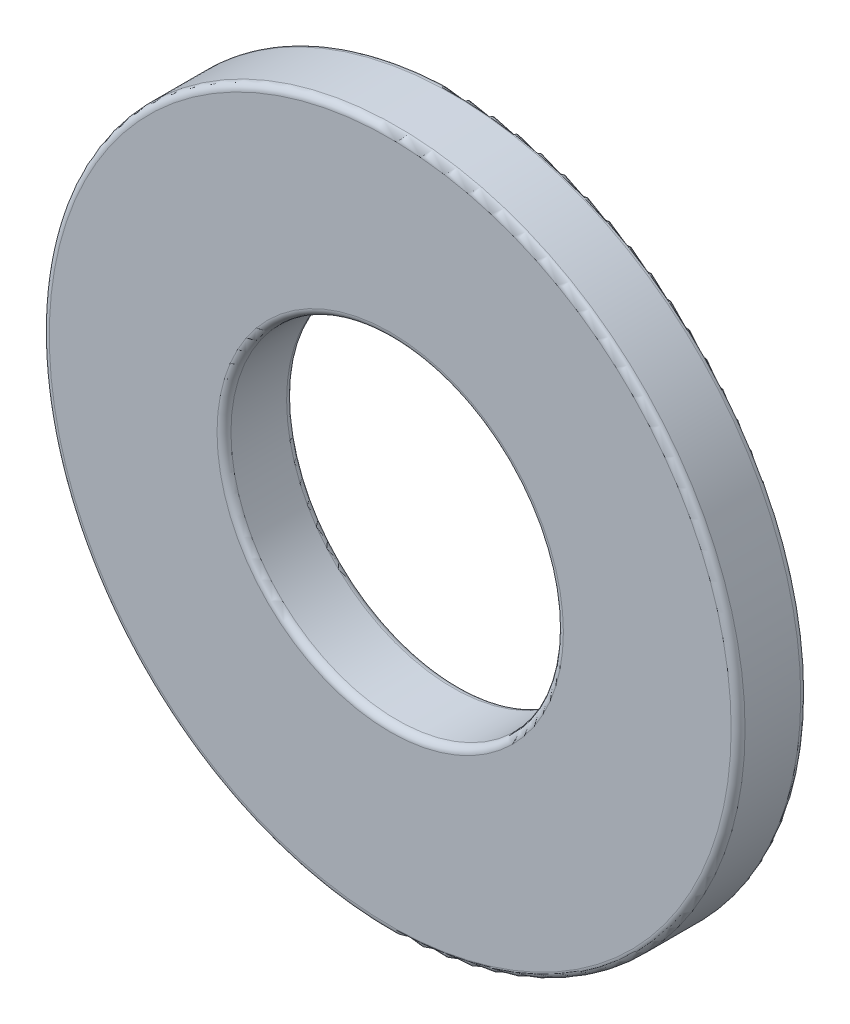
ISO-10303-21;
HEADER;
FILE_DESCRIPTION(('STEP AP214'),'2;1');
FILE_NAME('part.step','',(''),(''),'','','');
FILE_SCHEMA(('AUTOMOTIVE_DESIGN { 1 0 10303 214 1 1 1 1 }'));
ENDSEC;
DATA;
#1=APPLICATION_CONTEXT('core data for automotive mechanical design processes');
#2=APPLICATION_PROTOCOL_DEFINITION('international standard','automotive_design',2000,#1);
#3=PRODUCT_CONTEXT('',#1,'mechanical');
#4=PRODUCT('Part','Part','',(#3));
#5=PRODUCT_RELATED_PRODUCT_CATEGORY('part','',(#4));
#6=PRODUCT_DEFINITION_FORMATION('','',#4);
#7=PRODUCT_DEFINITION_CONTEXT('part definition',#1,'design');
#8=PRODUCT_DEFINITION('design','',#6,#7);
#9=PRODUCT_DEFINITION_SHAPE('','',#8);
#10=(LENGTH_UNIT() NAMED_UNIT(*) SI_UNIT(.MILLI.,.METRE.));
#11=(NAMED_UNIT(*) PLANE_ANGLE_UNIT() SI_UNIT($,.RADIAN.));
#12=(NAMED_UNIT(*) SI_UNIT($,.STERADIAN.) SOLID_ANGLE_UNIT());
#13=UNCERTAINTY_MEASURE_WITH_UNIT(LENGTH_MEASURE(1.E-05),#10,'distance_accuracy_value','');
#14=(GEOMETRIC_REPRESENTATION_CONTEXT(3) GLOBAL_UNCERTAINTY_ASSIGNED_CONTEXT((#13)) GLOBAL_UNIT_ASSIGNED_CONTEXT((#10,
#11,#12)) REPRESENTATION_CONTEXT('',''));
#15=CARTESIAN_POINT('',(0.,0.,0.));
#16=DIRECTION('',(0.,0.,1.));
#17=DIRECTION('',(1.,0.,0.));
#18=AXIS2_PLACEMENT_3D('',#15,#16,#17);
#19=CARTESIAN_POINT('',(0.,0.,-0.449999999999994));
#20=DIRECTION('',(0.,0.,1.));
#21=DIRECTION('',(1.,0.,0.));
#22=AXIS2_PLACEMENT_3D('',#19,#20,#21);
#23=CYLINDRICAL_SURFACE('',#22,4.5);
#24=CARTESIAN_POINT('',(0.,0.,-0.359999999999994));
#25=DIRECTION('',(0.,0.,1.));
#26=DIRECTION('',(1.,0.,0.));
#27=AXIS2_PLACEMENT_3D('',#24,#25,#26);
#28=CIRCLE('',#27,4.5);
#29=CARTESIAN_POINT('',(4.5,0.,-0.359999999999994));
#30=VERTEX_POINT('',#29);
#31=EDGE_CURVE('E73',#30,#30,#28,.T.);
#32=CARTESIAN_POINT('',(0.,0.,0.360000000000006));
#33=DIRECTION('',(0.,0.,1.));
#34=DIRECTION('',(1.,0.,0.));
#35=AXIS2_PLACEMENT_3D('',#32,#33,#34);
#36=CIRCLE('',#35,4.5);
#37=CARTESIAN_POINT('',(4.5,0.,0.360000000000006));
#38=VERTEX_POINT('',#37);
#39=EDGE_CURVE('E77',#38,#38,#36,.F.);
#40=CARTESIAN_POINT('',(4.5,0.,-0.359999999999994));
#41=CARTESIAN_POINT('',(4.5,0.,-0.352499999999994));
#42=CARTESIAN_POINT('',(4.5,0.,-0.344999999999994));
#43=CARTESIAN_POINT('',(4.5,0.,-0.329999999999994));
#44=CARTESIAN_POINT('',(4.5,0.,-0.322499999999994));
#45=CARTESIAN_POINT('',(4.5,0.,-0.307499999999994));
#46=CARTESIAN_POINT('',(4.5,0.,-0.299999999999994));
#47=CARTESIAN_POINT('',(4.5,0.,-0.284999999999994));
#48=CARTESIAN_POINT('',(4.5,0.,-0.277499999999994));
#49=CARTESIAN_POINT('',(4.5,0.,-0.262499999999994));
#50=CARTESIAN_POINT('',(4.5,0.,-0.254999999999994));
#51=CARTESIAN_POINT('',(4.5,0.,-0.239999999999994));
#52=CARTESIAN_POINT('',(4.5,0.,-0.232499999999994));
#53=CARTESIAN_POINT('',(4.5,0.,-0.217499999999994));
#54=CARTESIAN_POINT('',(4.5,0.,-0.209999999999994));
#55=CARTESIAN_POINT('',(4.5,0.,-0.194999999999994));
#56=CARTESIAN_POINT('',(4.5,0.,-0.187499999999994));
#57=CARTESIAN_POINT('',(4.5,0.,-0.172499999999994));
#58=CARTESIAN_POINT('',(4.5,0.,-0.164999999999994));
#59=CARTESIAN_POINT('',(4.5,0.,-0.149999999999994));
#60=CARTESIAN_POINT('',(4.5,0.,-0.142499999999994));
#61=CARTESIAN_POINT('',(4.5,0.,-0.127499999999994));
#62=CARTESIAN_POINT('',(4.5,0.,-0.119999999999994));
#63=CARTESIAN_POINT('',(4.5,0.,-0.104999999999994));
#64=CARTESIAN_POINT('',(4.5,0.,-0.0974999999999938));
#65=CARTESIAN_POINT('',(4.5,0.,-0.0824999999999938));
#66=CARTESIAN_POINT('',(4.5,0.,-0.0749999999999938));
#67=CARTESIAN_POINT('',(4.5,0.,-0.0599999999999938));
#68=CARTESIAN_POINT('',(4.5,0.,-0.0524999999999938));
#69=CARTESIAN_POINT('',(4.5,0.,-0.0374999999999938));
#70=CARTESIAN_POINT('',(4.5,0.,-0.0299999999999938));
#71=CARTESIAN_POINT('',(4.5,0.,-0.0149999999999938));
#72=CARTESIAN_POINT('',(4.5,0.,-0.00749999999999379));
#73=CARTESIAN_POINT('',(4.5,0.,0.00750000000000622));
#74=CARTESIAN_POINT('',(4.5,0.,0.0150000000000062));
#75=CARTESIAN_POINT('',(4.5,0.,0.0300000000000062));
#76=CARTESIAN_POINT('',(4.5,0.,0.0375000000000062));
#77=CARTESIAN_POINT('',(4.5,0.,0.0525000000000062));
#78=CARTESIAN_POINT('',(4.5,0.,0.0600000000000062));
#79=CARTESIAN_POINT('',(4.5,0.,0.0750000000000062));
#80=CARTESIAN_POINT('',(4.5,0.,0.0825000000000062));
#81=CARTESIAN_POINT('',(4.5,0.,0.0975000000000062));
#82=CARTESIAN_POINT('',(4.5,0.,0.105000000000006));
#83=CARTESIAN_POINT('',(4.5,0.,0.120000000000006));
#84=CARTESIAN_POINT('',(4.5,0.,0.127500000000006));
#85=CARTESIAN_POINT('',(4.5,0.,0.142500000000006));
#86=CARTESIAN_POINT('',(4.5,0.,0.150000000000006));
#87=CARTESIAN_POINT('',(4.5,0.,0.165000000000006));
#88=CARTESIAN_POINT('',(4.5,0.,0.172500000000006));
#89=CARTESIAN_POINT('',(4.5,0.,0.187500000000006));
#90=CARTESIAN_POINT('',(4.5,0.,0.195000000000006));
#91=CARTESIAN_POINT('',(4.5,0.,0.210000000000006));
#92=CARTESIAN_POINT('',(4.5,0.,0.217500000000006));
#93=CARTESIAN_POINT('',(4.5,0.,0.232500000000006));
#94=CARTESIAN_POINT('',(4.5,0.,0.240000000000006));
#95=CARTESIAN_POINT('',(4.5,0.,0.255000000000006));
#96=CARTESIAN_POINT('',(4.5,0.,0.262500000000006));
#97=CARTESIAN_POINT('',(4.5,0.,0.277500000000006));
#98=CARTESIAN_POINT('',(4.5,0.,0.285000000000006));
#99=CARTESIAN_POINT('',(4.5,0.,0.300000000000006));
#100=CARTESIAN_POINT('',(4.5,0.,0.307500000000006));
#101=CARTESIAN_POINT('',(4.5,0.,0.322500000000006));
#102=CARTESIAN_POINT('',(4.5,0.,0.330000000000006));
#103=CARTESIAN_POINT('',(4.5,0.,0.345000000000006));
#104=CARTESIAN_POINT('',(4.5,0.,0.352500000000006));
#105=CARTESIAN_POINT('',(4.5,0.,0.360000000000006));
#106=B_SPLINE_CURVE_WITH_KNOTS('',3,(#40,#41,#42,#43,#44,#45,#46,#47,#48,#49,#50,#51,#52,#53,
#54,#55,#56,#57,#58,#59,#60,#61,#62,#63,#64,#65,#66,#67,#68,#69,#70,#71,#72,#73,#74,#75,#76,#77,
#78,#79,#80,#81,#82,#83,#84,#85,#86,#87,#88,#89,#90,#91,#92,#93,#94,#95,#96,#97,#98,#99,#100,
#101,#102,#103,#104,#105),.UNSPECIFIED.,.F.,.F.,(4,2,2,2,2,2,2,2,2,2,2,2,2,2,2,2,2,2,2,2,2,2,2,
2,2,2,2,2,2,2,2,2,4),(0.,0.0225,0.045,0.0675,0.09,0.1125,0.135,0.1575,0.18,0.2025,0.225,0.2475,
0.27,0.2925,0.315,0.3375,0.36,0.3825,0.405,0.4275,0.45,0.4725,0.495,0.5175,0.54,0.5625,0.585,
0.6075,0.63,0.6525,0.675,0.6975,0.72),.UNSPECIFIED.);
#107=EDGE_CURVE('BSEAM41',#30,#38,#106,.T.);
#108=ORIENTED_EDGE('',*,*,#31,.T.);
#109=ORIENTED_EDGE('',*,*,#39,.T.);
#110=ORIENTED_EDGE('',*,*,#107,.T.);
#111=ORIENTED_EDGE('',*,*,#107,.F.);
#112=EDGE_LOOP('',(#108,#110,#109,#111));
#113=FACE_BOUND('',#112,.T.);
#114=ADVANCED_FACE('F41',(#113),#23,.T.);
#115=CARTESIAN_POINT('',(0.,0.,-0.449999999999994));
#116=DIRECTION('',(0.,0.,1.));
#117=DIRECTION('',(1.,0.,0.));
#118=AXIS2_PLACEMENT_3D('',#115,#116,#117);
#119=PLANE('',#118);
#120=CARTESIAN_POINT('',(0.,0.,-0.449999999999994));
#121=DIRECTION('',(0.,0.,1.));
#122=DIRECTION('',(1.,0.,0.));
#123=AXIS2_PLACEMENT_3D('',#120,#121,#122);
#124=CIRCLE('',#123,4.41);
#125=CARTESIAN_POINT('',(4.41,0.,-0.449999999999994));
#126=VERTEX_POINT('',#125);
#127=EDGE_CURVE('E65',#126,#126,#124,.F.);
#128=ORIENTED_EDGE('',*,*,#127,.T.);
#129=EDGE_LOOP('',(#128));
#130=FACE_BOUND('',#129,.T.);
#131=CARTESIAN_POINT('',(0.,0.,-0.449999999999994));
#132=DIRECTION('',(0.,0.,1.));
#133=DIRECTION('',(1.,0.,0.));
#134=AXIS2_PLACEMENT_3D('',#131,#132,#133);
#135=CIRCLE('',#134,2.24);
#136=CARTESIAN_POINT('',(2.24,0.,-0.449999999999994));
#137=VERTEX_POINT('',#136);
#138=EDGE_CURVE('E69',#137,#137,#135,.T.);
#139=ORIENTED_EDGE('',*,*,#138,.T.);
#140=EDGE_LOOP('',(#139));
#141=FACE_BOUND('',#140,.T.);
#142=ADVANCED_FACE('F92',(#130,#141),#119,.F.);
#143=CARTESIAN_POINT('',(0.,0.,-0.449999999999994));
#144=DIRECTION('',(0.,0.,1.));
#145=DIRECTION('',(1.,0.,0.));
#146=AXIS2_PLACEMENT_3D('',#143,#144,#145);
#147=CYLINDRICAL_SURFACE('',#146,2.15);
#148=CARTESIAN_POINT('',(0.,0.,-0.359999999999994));
#149=DIRECTION('',(0.,0.,1.));
#150=DIRECTION('',(1.,0.,0.));
#151=AXIS2_PLACEMENT_3D('',#148,#149,#150);
#152=CIRCLE('',#151,2.15);
#153=CARTESIAN_POINT('',(2.15,0.,-0.359999999999994));
#154=VERTEX_POINT('',#153);
#155=EDGE_CURVE('E54',#154,#154,#152,.F.);
#156=CARTESIAN_POINT('',(0.,0.,0.360000000000006));
#157=DIRECTION('',(0.,0.,1.));
#158=DIRECTION('',(1.,0.,0.));
#159=AXIS2_PLACEMENT_3D('',#156,#157,#158);
#160=CIRCLE('',#159,2.15);
#161=CARTESIAN_POINT('',(2.15,0.,0.360000000000006));
#162=VERTEX_POINT('',#161);
#163=EDGE_CURVE('E59',#162,#162,#160,.T.);
#164=CARTESIAN_POINT('',(2.15,0.,-0.359999999999994));
#165=CARTESIAN_POINT('',(2.15,0.,-0.352499999999994));
#166=CARTESIAN_POINT('',(2.15,0.,-0.344999999999994));
#167=CARTESIAN_POINT('',(2.15,0.,-0.329999999999994));
#168=CARTESIAN_POINT('',(2.15,0.,-0.322499999999994));
#169=CARTESIAN_POINT('',(2.15,0.,-0.307499999999994));
#170=CARTESIAN_POINT('',(2.15,0.,-0.299999999999994));
#171=CARTESIAN_POINT('',(2.15,0.,-0.284999999999994));
#172=CARTESIAN_POINT('',(2.15,0.,-0.277499999999994));
#173=CARTESIAN_POINT('',(2.15,0.,-0.262499999999994));
#174=CARTESIAN_POINT('',(2.15,0.,-0.254999999999994));
#175=CARTESIAN_POINT('',(2.15,0.,-0.239999999999994));
#176=CARTESIAN_POINT('',(2.15,0.,-0.232499999999994));
#177=CARTESIAN_POINT('',(2.15,0.,-0.217499999999994));
#178=CARTESIAN_POINT('',(2.15,0.,-0.209999999999994));
#179=CARTESIAN_POINT('',(2.15,0.,-0.194999999999994));
#180=CARTESIAN_POINT('',(2.15,0.,-0.187499999999994));
#181=CARTESIAN_POINT('',(2.15,0.,-0.172499999999994));
#182=CARTESIAN_POINT('',(2.15,0.,-0.164999999999994));
#183=CARTESIAN_POINT('',(2.15,0.,-0.149999999999994));
#184=CARTESIAN_POINT('',(2.15,0.,-0.142499999999994));
#185=CARTESIAN_POINT('',(2.15,0.,-0.127499999999994));
#186=CARTESIAN_POINT('',(2.15,0.,-0.119999999999994));
#187=CARTESIAN_POINT('',(2.15,0.,-0.104999999999994));
#188=CARTESIAN_POINT('',(2.15,0.,-0.0974999999999938));
#189=CARTESIAN_POINT('',(2.15,0.,-0.0824999999999938));
#190=CARTESIAN_POINT('',(2.15,0.,-0.0749999999999938));
#191=CARTESIAN_POINT('',(2.15,0.,-0.0599999999999938));
#192=CARTESIAN_POINT('',(2.15,0.,-0.0524999999999938));
#193=CARTESIAN_POINT('',(2.15,0.,-0.0374999999999938));
#194=CARTESIAN_POINT('',(2.15,0.,-0.0299999999999938));
#195=CARTESIAN_POINT('',(2.15,0.,-0.0149999999999938));
#196=CARTESIAN_POINT('',(2.15,0.,-0.00749999999999379));
#197=CARTESIAN_POINT('',(2.15,0.,0.00750000000000622));
#198=CARTESIAN_POINT('',(2.15,0.,0.0150000000000062));
#199=CARTESIAN_POINT('',(2.15,0.,0.0300000000000062));
#200=CARTESIAN_POINT('',(2.15,0.,0.0375000000000062));
#201=CARTESIAN_POINT('',(2.15,0.,0.0525000000000062));
#202=CARTESIAN_POINT('',(2.15,0.,0.0600000000000062));
#203=CARTESIAN_POINT('',(2.15,0.,0.0750000000000062));
#204=CARTESIAN_POINT('',(2.15,0.,0.0825000000000062));
#205=CARTESIAN_POINT('',(2.15,0.,0.0975000000000062));
#206=CARTESIAN_POINT('',(2.15,0.,0.105000000000006));
#207=CARTESIAN_POINT('',(2.15,0.,0.120000000000006));
#208=CARTESIAN_POINT('',(2.15,0.,0.127500000000006));
#209=CARTESIAN_POINT('',(2.15,0.,0.142500000000006));
#210=CARTESIAN_POINT('',(2.15,0.,0.150000000000006));
#211=CARTESIAN_POINT('',(2.15,0.,0.165000000000006));
#212=CARTESIAN_POINT('',(2.15,0.,0.172500000000006));
#213=CARTESIAN_POINT('',(2.15,0.,0.187500000000006));
#214=CARTESIAN_POINT('',(2.15,0.,0.195000000000006));
#215=CARTESIAN_POINT('',(2.15,0.,0.210000000000006));
#216=CARTESIAN_POINT('',(2.15,0.,0.217500000000006));
#217=CARTESIAN_POINT('',(2.15,0.,0.232500000000006));
#218=CARTESIAN_POINT('',(2.15,0.,0.240000000000006));
#219=CARTESIAN_POINT('',(2.15,0.,0.255000000000006));
#220=CARTESIAN_POINT('',(2.15,0.,0.262500000000006));
#221=CARTESIAN_POINT('',(2.15,0.,0.277500000000006));
#222=CARTESIAN_POINT('',(2.15,0.,0.285000000000006));
#223=CARTESIAN_POINT('',(2.15,0.,0.300000000000006));
#224=CARTESIAN_POINT('',(2.15,0.,0.307500000000006));
#225=CARTESIAN_POINT('',(2.15,0.,0.322500000000006));
#226=CARTESIAN_POINT('',(2.15,0.,0.330000000000006));
#227=CARTESIAN_POINT('',(2.15,0.,0.345000000000006));
#228=CARTESIAN_POINT('',(2.15,0.,0.352500000000006));
#229=CARTESIAN_POINT('',(2.15,0.,0.360000000000006));
#230=B_SPLINE_CURVE_WITH_KNOTS('',3,(#164,#165,#166,#167,#168,#169,#170,#171,#172,#173,#174,
#175,#176,#177,#178,#179,#180,#181,#182,#183,#184,#185,#186,#187,#188,#189,#190,#191,#192,#193,
#194,#195,#196,#197,#198,#199,#200,#201,#202,#203,#204,#205,#206,#207,#208,#209,#210,#211,#212,
#213,#214,#215,#216,#217,#218,#219,#220,#221,#222,#223,#224,#225,#226,#227,#228,#229),
.UNSPECIFIED.,.F.,.F.,(4,2,2,2,2,2,2,2,2,2,2,2,2,2,2,2,2,2,2,2,2,2,2,2,2,2,2,2,2,2,2,2,4),(0.,
0.0225,0.045,0.0675,0.09,0.1125,0.135,0.1575,0.18,0.2025,0.225,0.2475,0.27,0.2925,0.315,0.3375,
0.36,0.3825,0.405,0.4275,0.45,0.4725,0.495,0.5175,0.54,0.5625,0.585,0.6075,0.63,0.6525,0.675,
0.6975,0.72),.UNSPECIFIED.);
#231=EDGE_CURVE('BSEAM98',#154,#162,#230,.T.);
#232=ORIENTED_EDGE('',*,*,#155,.T.);
#233=ORIENTED_EDGE('',*,*,#163,.T.);
#234=ORIENTED_EDGE('',*,*,#231,.T.);
#235=ORIENTED_EDGE('',*,*,#231,.F.);
#236=EDGE_LOOP('',(#232,#234,#233,#235));
#237=FACE_BOUND('',#236,.T.);
#238=ADVANCED_FACE('F98',(#237),#147,.F.);
#239=CARTESIAN_POINT('',(0.,0.,0.450000000000006));
#240=DIRECTION('',(0.,0.,1.));
#241=DIRECTION('',(1.,0.,0.));
#242=AXIS2_PLACEMENT_3D('',#239,#240,#241);
#243=PLANE('',#242);
#244=CARTESIAN_POINT('',(0.,0.,0.450000000000006));
#245=DIRECTION('',(0.,0.,1.));
#246=DIRECTION('',(1.,0.,0.));
#247=AXIS2_PLACEMENT_3D('',#244,#245,#246);
#248=CIRCLE('',#247,2.24);
#249=CARTESIAN_POINT('',(2.24,0.,0.450000000000006));
#250=VERTEX_POINT('',#249);
#251=EDGE_CURVE('E10',#250,#250,#248,.F.);
#252=ORIENTED_EDGE('',*,*,#251,.T.);
#253=EDGE_LOOP('',(#252));
#254=FACE_BOUND('',#253,.T.);
#255=CARTESIAN_POINT('',(0.,0.,0.450000000000006));
#256=DIRECTION('',(0.,0.,1.));
#257=DIRECTION('',(1.,0.,0.));
#258=AXIS2_PLACEMENT_3D('',#255,#256,#257);
#259=CIRCLE('',#258,4.41);
#260=CARTESIAN_POINT('',(4.41,0.,0.450000000000006));
#261=VERTEX_POINT('',#260);
#262=EDGE_CURVE('E49',#261,#261,#259,.T.);
#263=ORIENTED_EDGE('',*,*,#262,.T.);
#264=EDGE_LOOP('',(#263));
#265=FACE_BOUND('',#264,.T.);
#266=ADVANCED_FACE('F106',(#254,#265),#243,.T.);
#267=CARTESIAN_POINT('',(0.,0.,-0.359999999999994));
#268=DIRECTION('',(0.,0.,1.));
#269=DIRECTION('',(1.,0.,0.));
#270=AXIS2_PLACEMENT_3D('',#267,#268,#269);
#271=TOROIDAL_SURFACE('',#270,4.41,0.09);
#272=ORIENTED_EDGE('',*,*,#127,.F.);
#273=EDGE_LOOP('',(#272));
#274=FACE_BOUND('',#273,.T.);
#275=ORIENTED_EDGE('',*,*,#31,.F.);
#276=EDGE_LOOP('',(#275));
#277=FACE_BOUND('',#276,.T.);
#278=ADVANCED_FACE('F103',(#274,#277),#271,.T.);
#279=CARTESIAN_POINT('',(0.,0.,-0.359999999999994));
#280=DIRECTION('',(0.,0.,1.));
#281=DIRECTION('',(1.,0.,0.));
#282=AXIS2_PLACEMENT_3D('',#279,#280,#281);
#283=TOROIDAL_SURFACE('',#282,2.24,0.09);
#284=ORIENTED_EDGE('',*,*,#155,.F.);
#285=EDGE_LOOP('',(#284));
#286=FACE_BOUND('',#285,.T.);
#287=ORIENTED_EDGE('',*,*,#138,.F.);
#288=EDGE_LOOP('',(#287));
#289=FACE_BOUND('',#288,.T.);
#290=ADVANCED_FACE('F89',(#286,#289),#283,.T.);
#291=CARTESIAN_POINT('',(0.,0.,0.360000000000006));
#292=DIRECTION('',(0.,0.,1.));
#293=DIRECTION('',(1.,0.,0.));
#294=AXIS2_PLACEMENT_3D('',#291,#292,#293);
#295=TOROIDAL_SURFACE('',#294,2.24,0.09);
#296=ORIENTED_EDGE('',*,*,#251,.F.);
#297=EDGE_LOOP('',(#296));
#298=FACE_BOUND('',#297,.T.);
#299=ORIENTED_EDGE('',*,*,#163,.F.);
#300=EDGE_LOOP('',(#299));
#301=FACE_BOUND('',#300,.T.);
#302=ADVANCED_FACE('F85',(#298,#301),#295,.T.);
#303=CARTESIAN_POINT('',(0.,0.,0.360000000000006));
#304=DIRECTION('',(0.,0.,1.));
#305=DIRECTION('',(1.,0.,0.));
#306=AXIS2_PLACEMENT_3D('',#303,#304,#305);
#307=TOROIDAL_SURFACE('',#306,4.41,0.09);
#308=ORIENTED_EDGE('',*,*,#39,.F.);
#309=EDGE_LOOP('',(#308));
#310=FACE_BOUND('',#309,.T.);
#311=ORIENTED_EDGE('',*,*,#262,.F.);
#312=EDGE_LOOP('',(#311));
#313=FACE_BOUND('',#312,.T.);
#314=ADVANCED_FACE('F43',(#310,#313),#307,.T.);
#315=CLOSED_SHELL('',(#114,#142,#238,#266,#278,#290,#302,#314));
#316=MANIFOLD_SOLID_BREP('B2',#315);
#317=ADVANCED_BREP_SHAPE_REPRESENTATION('',(#18,#316),#14);
#318=SHAPE_DEFINITION_REPRESENTATION(#9,#317);
ENDSEC;
END-ISO-10303-21;
